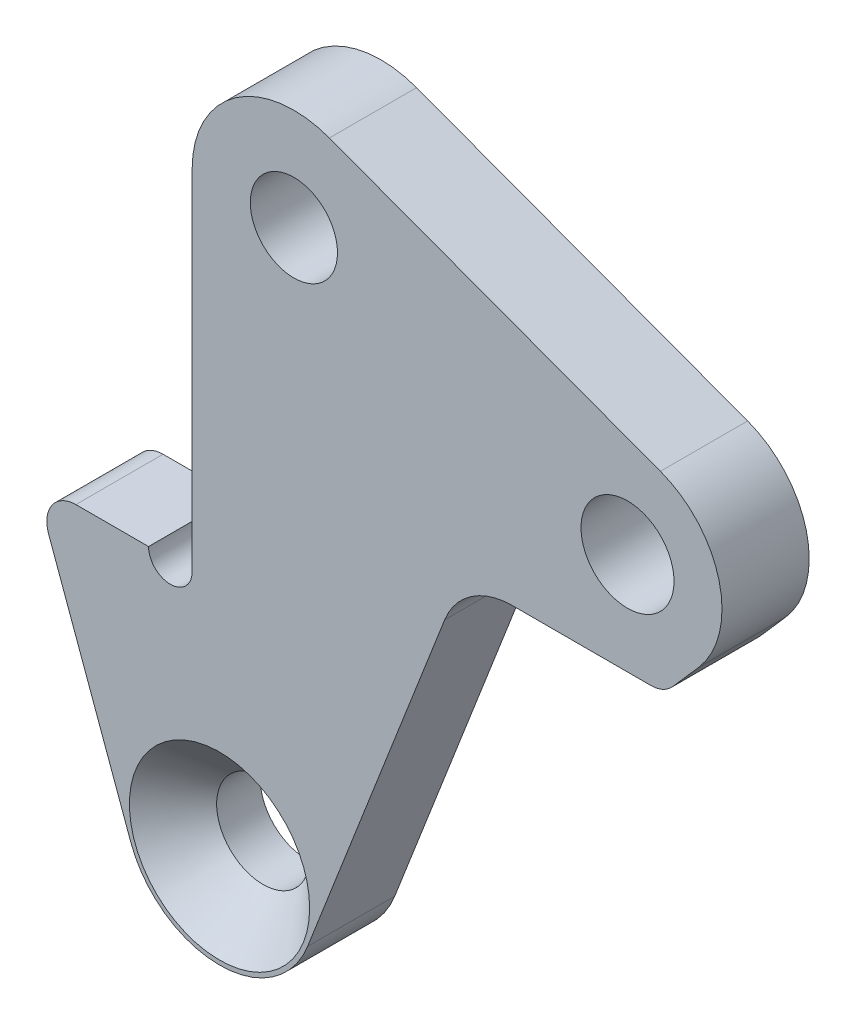
ISO-10303-21;
HEADER;
FILE_DESCRIPTION(('STEP AP214'),'2;1');
FILE_NAME('part.step','',(''),(''),'','','');
FILE_SCHEMA(('AUTOMOTIVE_DESIGN { 1 0 10303 214 1 1 1 1 }'));
ENDSEC;
DATA;
#1=APPLICATION_CONTEXT('core data for automotive mechanical design processes');
#2=APPLICATION_PROTOCOL_DEFINITION('international standard','automotive_design',2000,#1);
#3=PRODUCT_CONTEXT('',#1,'mechanical');
#4=PRODUCT('Part','Part','',(#3));
#5=PRODUCT_RELATED_PRODUCT_CATEGORY('part','',(#4));
#6=PRODUCT_DEFINITION_FORMATION('','',#4);
#7=PRODUCT_DEFINITION_CONTEXT('part definition',#1,'design');
#8=PRODUCT_DEFINITION('design','',#6,#7);
#9=PRODUCT_DEFINITION_SHAPE('','',#8);
#10=(LENGTH_UNIT() NAMED_UNIT(*) SI_UNIT(.MILLI.,.METRE.));
#11=(NAMED_UNIT(*) PLANE_ANGLE_UNIT() SI_UNIT($,.RADIAN.));
#12=(NAMED_UNIT(*) SI_UNIT($,.STERADIAN.) SOLID_ANGLE_UNIT());
#13=UNCERTAINTY_MEASURE_WITH_UNIT(LENGTH_MEASURE(1.E-05),#10,'distance_accuracy_value','');
#14=(GEOMETRIC_REPRESENTATION_CONTEXT(3) GLOBAL_UNCERTAINTY_ASSIGNED_CONTEXT((#13)) GLOBAL_UNIT_ASSIGNED_CONTEXT((#10,
#11,#12)) REPRESENTATION_CONTEXT('',''));
#15=CARTESIAN_POINT('',(0.,0.,0.));
#16=DIRECTION('',(0.,0.,1.));
#17=DIRECTION('',(1.,0.,0.));
#18=AXIS2_PLACEMENT_3D('',#15,#16,#17);
#19=CARTESIAN_POINT('',(0.,0.,1.5));
#20=DIRECTION('',(0.,0.,-1.));
#21=DIRECTION('',(-1.,0.,0.));
#22=AXIS2_PLACEMENT_3D('',#19,#20,#21);
#23=PLANE('',#22);
#24=CARTESIAN_POINT('',(-2.55780837206581,-20.,1.5));
#25=DIRECTION('',(0.,0.,-1.));
#26=DIRECTION('',(-1.,0.,0.));
#27=AXIS2_PLACEMENT_3D('',#24,#25,#26);
#28=CIRCLE('',#27,3.10000000000002);
#29=CARTESIAN_POINT('',(0.542191627934207,-20.,1.5));
#30=VERTEX_POINT('',#29);
#31=EDGE_CURVE('E248',#30,#30,#28,.T.);
#32=ORIENTED_EDGE('',*,*,#31,.T.);
#33=EDGE_LOOP('',(#32));
#34=FACE_BOUND('',#33,.T.);
#35=CARTESIAN_POINT('',(0.,0.,1.5));
#36=DIRECTION('',(0.,0.,1.));
#37=DIRECTION('',(1.,0.,0.));
#38=AXIS2_PLACEMENT_3D('',#35,#36,#37);
#39=CIRCLE('',#38,1.5);
#40=CARTESIAN_POINT('',(1.5,0.,1.5));
#41=VERTEX_POINT('',#40);
#42=EDGE_CURVE('E185',#41,#41,#39,.T.);
#43=ORIENTED_EDGE('',*,*,#42,.F.);
#44=EDGE_LOOP('',(#43));
#45=FACE_BOUND('',#44,.T.);
#46=CARTESIAN_POINT('',(11.4771790394003,-4.,1.5));
#47=DIRECTION('',(0.,0.,1.));
#48=DIRECTION('',(1.,0.,0.));
#49=AXIS2_PLACEMENT_3D('',#46,#47,#48);
#50=CIRCLE('',#49,1.6);
#51=CARTESIAN_POINT('',(13.0771790394003,-4.,1.5));
#52=VERTEX_POINT('',#51);
#53=EDGE_CURVE('E176',#52,#52,#50,.T.);
#54=ORIENTED_EDGE('',*,*,#53,.F.);
#55=EDGE_LOOP('',(#54));
#56=FACE_BOUND('',#55,.T.);
#57=DIRECTION('',(-1.,0.,0.));
#58=VECTOR('',#57,1.);
#59=CARTESIAN_POINT('',(5.80742685174699,-7.5,1.5));
#60=LINE('',#59,#58);
#61=CARTESIAN_POINT('',(12.2771829682659,-7.5,1.5));
#62=VERTEX_POINT('',#61);
#63=CARTESIAN_POINT('',(7.51561342335569,-7.5,1.5));
#64=VERTEX_POINT('',#63);
#65=EDGE_CURVE('E148',#62,#64,#60,.T.);
#66=ORIENTED_EDGE('',*,*,#65,.F.);
#67=CARTESIAN_POINT('',(12.2771829682659,-6.5,1.5));
#68=DIRECTION('',(0.,0.,-1.));
#69=DIRECTION('',(-1.,0.,0.));
#70=AXIS2_PLACEMENT_3D('',#67,#68,#69);
#71=CIRCLE('',#70,1.);
#72=CARTESIAN_POINT('',(13.0289444175339,-7.15943515480637,1.5));
#73=VERTEX_POINT('',#72);
#74=EDGE_CURVE('E59',#62,#73,#71,.F.);
#75=ORIENTED_EDGE('',*,*,#74,.T.);
#76=DIRECTION('',(0.659435154806362,0.75176144926799,0.));
#77=VECTOR('',#76,1.);
#78=CARTESIAN_POINT('',(-0.114583661944843,-22.1431642531207,1.5));
#79=LINE('',#78,#77);
#80=CARTESIAN_POINT('',(13.9204037495213,-6.14316425312068,1.5));
#81=VERTEX_POINT('',#80);
#82=EDGE_CURVE('E203',#73,#81,#79,.T.);
#83=ORIENTED_EDGE('',*,*,#82,.T.);
#84=CARTESIAN_POINT('',(11.4771790394003,-4.,1.5));
#85=DIRECTION('',(0.,0.,1.));
#86=DIRECTION('',(1.,0.,0.));
#87=AXIS2_PLACEMENT_3D('',#84,#85,#86);
#88=CIRCLE('',#87,3.25);
#89=CARTESIAN_POINT('',(12.6096632094642,-0.953694105222709,1.5));
#90=VERTEX_POINT('',#89);
#91=EDGE_CURVE('E205',#81,#90,#88,.T.);
#92=ORIENTED_EDGE('',*,*,#91,.T.);
#93=DIRECTION('',(-0.937324890700704,0.348456667711945,0.));
#94=VECTOR('',#93,1.);
#95=CARTESIAN_POINT('',(1.21959833699181,3.28063711745247,1.5));
#96=LINE('',#95,#94);
#97=CARTESIAN_POINT('',(1.21959833699181,3.28063711745247,1.5));
#98=VERTEX_POINT('',#97);
#99=EDGE_CURVE('E207',#90,#98,#96,.T.);
#100=ORIENTED_EDGE('',*,*,#99,.T.);
#101=CARTESIAN_POINT('',(0.,0.,1.5));
#102=DIRECTION('',(0.,0.,1.));
#103=DIRECTION('',(-1.,0.,0.));
#104=AXIS2_PLACEMENT_3D('',#101,#102,#103);
#105=CIRCLE('',#104,3.5);
#106=CARTESIAN_POINT('',(-3.5,0.,1.5));
#107=VERTEX_POINT('',#106);
#108=EDGE_CURVE('E209',#98,#107,#105,.T.);
#109=ORIENTED_EDGE('',*,*,#108,.T.);
#110=DIRECTION('',(0.,-1.,0.));
#111=VECTOR('',#110,1.);
#112=CARTESIAN_POINT('',(-3.5,-12.,1.5));
#113=LINE('',#112,#111);
#114=CARTESIAN_POINT('',(-3.5,-12.,1.5));
#115=VERTEX_POINT('',#114);
#116=EDGE_CURVE('E191',#107,#115,#113,.T.);
#117=ORIENTED_EDGE('',*,*,#116,.T.);
#118=CARTESIAN_POINT('',(-4.25,-12.,1.5));
#119=DIRECTION('',(0.,0.,1.));
#120=DIRECTION('',(1.,0.,0.));
#121=AXIS2_PLACEMENT_3D('',#118,#119,#120);
#122=CIRCLE('',#121,0.75);
#123=CARTESIAN_POINT('',(-5.,-12.,1.5));
#124=VERTEX_POINT('',#123);
#125=EDGE_CURVE('E165',#124,#115,#122,.T.);
#126=ORIENTED_EDGE('',*,*,#125,.F.);
#127=DIRECTION('',(-1.,0.,0.));
#128=VECTOR('',#127,1.);
#129=CARTESIAN_POINT('',(-7.5,-12.,1.5));
#130=LINE('',#129,#128);
#131=CARTESIAN_POINT('',(-7.5,-12.,1.5));
#132=VERTEX_POINT('',#131);
#133=EDGE_CURVE('E194',#124,#132,#130,.T.);
#134=ORIENTED_EDGE('',*,*,#133,.T.);
#135=CARTESIAN_POINT('',(-7.5,-13.,1.5));
#136=DIRECTION('',(0.,0.,1.));
#137=DIRECTION('',(1.,0.,0.));
#138=AXIS2_PLACEMENT_3D('',#135,#136,#137);
#139=CIRCLE('',#138,0.999999999999999);
#140=CARTESIAN_POINT('',(-8.43969262078591,-13.3420201433257,1.5));
#141=VERTEX_POINT('',#140);
#142=EDGE_CURVE('E197',#132,#141,#139,.T.);
#143=ORIENTED_EDGE('',*,*,#142,.T.);
#144=DIRECTION('',(0.342020143325666,-0.939692620785909,0.));
#145=VECTOR('',#144,1.);
#146=CARTESIAN_POINT('',(-8.43969262078591,-13.3420201433257,1.5));
#147=LINE('',#146,#145);
#148=CARTESIAN_POINT('',(-5.61180938962001,-21.1115654658084,1.5));
#149=VERTEX_POINT('',#148);
#150=EDGE_CURVE('E199',#141,#149,#147,.T.);
#151=ORIENTED_EDGE('',*,*,#150,.T.);
#152=CARTESIAN_POINT('',(-2.55780837206581,-20.,1.5));
#153=DIRECTION('',(0.,0.,1.));
#154=DIRECTION('',(1.,0.,0.));
#155=AXIS2_PLACEMENT_3D('',#152,#153,#154);
#156=CIRCLE('',#155,3.25);
#157=CARTESIAN_POINT('',(0.469932731190725,-21.1812213220438,1.5));
#158=VERTEX_POINT('',#157);
#159=EDGE_CURVE('E201',#149,#158,#156,.T.);
#160=ORIENTED_EDGE('',*,*,#159,.T.);
#161=DIRECTION('',(-0.363452714475013,-0.931612647155858,0.));
#162=VECTOR('',#161,1.);
#163=CARTESIAN_POINT('',(0.469932731190727,-21.1812213220438,1.5));
#164=LINE('',#163,#162);
#165=CARTESIAN_POINT('',(5.18658180546604,-9.09136821381247,1.5));
#166=VERTEX_POINT('',#165);
#167=EDGE_CURVE('E163',#166,#158,#164,.T.);
#168=ORIENTED_EDGE('',*,*,#167,.F.);
#169=CARTESIAN_POINT('',(7.51561342335569,-10.,1.5));
#170=DIRECTION('',(0.,0.,-1.));
#171=DIRECTION('',(-1.,0.,0.));
#172=AXIS2_PLACEMENT_3D('',#169,#170,#171);
#173=CIRCLE('',#172,2.5);
#174=EDGE_CURVE('E259',#166,#64,#173,.T.);
#175=ORIENTED_EDGE('',*,*,#174,.T.);
#176=EDGE_LOOP('',(#66,#75,#83,#92,#100,#109,#117,#126,#134,#143,#151,#160,#168,#175));
#177=FACE_BOUND('',#176,.T.);
#178=ADVANCED_FACE('F37',(#34,#45,#56,#177),#23,.F.);
#179=CARTESIAN_POINT('',(0.,0.,-1.5));
#180=DIRECTION('',(0.,0.,-1.));
#181=DIRECTION('',(-1.,0.,0.));
#182=AXIS2_PLACEMENT_3D('',#179,#180,#181);
#183=PLANE('',#182);
#184=CARTESIAN_POINT('',(11.4771790394003,-4.,-1.5));
#185=DIRECTION('',(0.,0.,1.));
#186=DIRECTION('',(1.,0.,0.));
#187=AXIS2_PLACEMENT_3D('',#184,#185,#186);
#188=CIRCLE('',#187,1.6);
#189=CARTESIAN_POINT('',(13.0771790394003,-4.,-1.5));
#190=VERTEX_POINT('',#189);
#191=EDGE_CURVE('E174',#190,#190,#188,.T.);
#192=ORIENTED_EDGE('',*,*,#191,.T.);
#193=EDGE_LOOP('',(#192));
#194=FACE_BOUND('',#193,.T.);
#195=CARTESIAN_POINT('',(0.,0.,-1.5));
#196=DIRECTION('',(0.,0.,1.));
#197=DIRECTION('',(1.,0.,0.));
#198=AXIS2_PLACEMENT_3D('',#195,#196,#197);
#199=CIRCLE('',#198,1.5);
#200=CARTESIAN_POINT('',(1.5,0.,-1.5));
#201=VERTEX_POINT('',#200);
#202=EDGE_CURVE('E184',#201,#201,#199,.T.);
#203=ORIENTED_EDGE('',*,*,#202,.T.);
#204=EDGE_LOOP('',(#203));
#205=FACE_BOUND('',#204,.T.);
#206=CARTESIAN_POINT('',(-2.55780837206581,-20.,-1.5));
#207=DIRECTION('',(0.,0.,1.));
#208=DIRECTION('',(1.,0.,0.));
#209=AXIS2_PLACEMENT_3D('',#206,#207,#208);
#210=CIRCLE('',#209,1.60000000000001);
#211=CARTESIAN_POINT('',(-0.957808372065798,-20.,-1.5));
#212=VERTEX_POINT('',#211);
#213=EDGE_CURVE('E179',#212,#212,#210,.T.);
#214=ORIENTED_EDGE('',*,*,#213,.T.);
#215=EDGE_LOOP('',(#214));
#216=FACE_BOUND('',#215,.T.);
#217=DIRECTION('',(0.659435154806362,0.75176144926799,0.));
#218=VECTOR('',#217,1.);
#219=CARTESIAN_POINT('',(-0.114583661944843,-22.1431642531207,-1.5));
#220=LINE('',#219,#218);
#221=CARTESIAN_POINT('',(13.0289444175339,-7.15943515480637,-1.5));
#222=VERTEX_POINT('',#221);
#223=CARTESIAN_POINT('',(13.9204037495213,-6.14316425312068,-1.5));
#224=VERTEX_POINT('',#223);
#225=EDGE_CURVE('E158',#222,#224,#220,.T.);
#226=ORIENTED_EDGE('',*,*,#225,.F.);
#227=CARTESIAN_POINT('',(12.2771829682659,-6.5,-1.5));
#228=DIRECTION('',(0.,0.,-1.));
#229=DIRECTION('',(-1.,0.,0.));
#230=AXIS2_PLACEMENT_3D('',#227,#228,#229);
#231=CIRCLE('',#230,1.);
#232=CARTESIAN_POINT('',(12.2771829682659,-7.5,-1.5));
#233=VERTEX_POINT('',#232);
#234=EDGE_CURVE('E11',#222,#233,#231,.T.);
#235=ORIENTED_EDGE('',*,*,#234,.T.);
#236=DIRECTION('',(-1.,0.,0.));
#237=VECTOR('',#236,1.);
#238=CARTESIAN_POINT('',(5.80742685174699,-7.5,-1.5));
#239=LINE('',#238,#237);
#240=CARTESIAN_POINT('',(7.51561342335569,-7.5,-1.5));
#241=VERTEX_POINT('',#240);
#242=EDGE_CURVE('E147',#233,#241,#239,.T.);
#243=ORIENTED_EDGE('',*,*,#242,.T.);
#244=CARTESIAN_POINT('',(7.51561342335569,-10.,-1.5));
#245=DIRECTION('',(0.,0.,-1.));
#246=DIRECTION('',(-1.,0.,0.));
#247=AXIS2_PLACEMENT_3D('',#244,#245,#246);
#248=CIRCLE('',#247,2.5);
#249=CARTESIAN_POINT('',(5.18658180546604,-9.09136821381247,-1.5));
#250=VERTEX_POINT('',#249);
#251=EDGE_CURVE('E142',#241,#250,#248,.F.);
#252=ORIENTED_EDGE('',*,*,#251,.T.);
#253=DIRECTION('',(-0.363452714475013,-0.931612647155858,0.));
#254=VECTOR('',#253,1.);
#255=CARTESIAN_POINT('',(0.469932731190727,-21.1812213220438,-1.5));
#256=LINE('',#255,#254);
#257=CARTESIAN_POINT('',(0.469932731190725,-21.1812213220438,-1.5));
#258=VERTEX_POINT('',#257);
#259=EDGE_CURVE('E136',#250,#258,#256,.T.);
#260=ORIENTED_EDGE('',*,*,#259,.T.);
#261=CARTESIAN_POINT('',(-2.55780837206581,-20.,-1.5));
#262=DIRECTION('',(0.,0.,1.));
#263=DIRECTION('',(1.,0.,0.));
#264=AXIS2_PLACEMENT_3D('',#261,#262,#263);
#265=CIRCLE('',#264,3.25);
#266=CARTESIAN_POINT('',(-5.61180938962001,-21.1115654658084,-1.5));
#267=VERTEX_POINT('',#266);
#268=EDGE_CURVE('E140',#267,#258,#265,.T.);
#269=ORIENTED_EDGE('',*,*,#268,.F.);
#270=DIRECTION('',(0.342020143325666,-0.939692620785909,0.));
#271=VECTOR('',#270,1.);
#272=CARTESIAN_POINT('',(-8.43969262078591,-13.3420201433257,-1.5));
#273=LINE('',#272,#271);
#274=CARTESIAN_POINT('',(-8.43969262078591,-13.3420201433257,-1.5));
#275=VERTEX_POINT('',#274);
#276=EDGE_CURVE('E159',#275,#267,#273,.T.);
#277=ORIENTED_EDGE('',*,*,#276,.F.);
#278=CARTESIAN_POINT('',(-7.5,-13.,-1.5));
#279=DIRECTION('',(0.,0.,1.));
#280=DIRECTION('',(1.,0.,0.));
#281=AXIS2_PLACEMENT_3D('',#278,#279,#280);
#282=CIRCLE('',#281,0.999999999999999);
#283=CARTESIAN_POINT('',(-7.5,-12.,-1.5));
#284=VERTEX_POINT('',#283);
#285=EDGE_CURVE('E216',#284,#275,#282,.T.);
#286=ORIENTED_EDGE('',*,*,#285,.F.);
#287=DIRECTION('',(-1.,0.,0.));
#288=VECTOR('',#287,1.);
#289=CARTESIAN_POINT('',(-7.5,-12.,-1.5));
#290=LINE('',#289,#288);
#291=CARTESIAN_POINT('',(-5.,-12.,-1.5));
#292=VERTEX_POINT('',#291);
#293=EDGE_CURVE('E214',#292,#284,#290,.T.);
#294=ORIENTED_EDGE('',*,*,#293,.F.);
#295=CARTESIAN_POINT('',(-4.25,-12.,-1.5));
#296=DIRECTION('',(0.,0.,1.));
#297=DIRECTION('',(1.,0.,0.));
#298=AXIS2_PLACEMENT_3D('',#295,#296,#297);
#299=CIRCLE('',#298,0.75);
#300=CARTESIAN_POINT('',(-3.5,-12.,-1.5));
#301=VERTEX_POINT('',#300);
#302=EDGE_CURVE('E167',#292,#301,#299,.T.);
#303=ORIENTED_EDGE('',*,*,#302,.T.);
#304=DIRECTION('',(0.,-1.,0.));
#305=VECTOR('',#304,1.);
#306=CARTESIAN_POINT('',(-3.5,-12.,-1.5));
#307=LINE('',#306,#305);
#308=CARTESIAN_POINT('',(-3.5,0.,-1.5));
#309=VERTEX_POINT('',#308);
#310=EDGE_CURVE('E188',#309,#301,#307,.T.);
#311=ORIENTED_EDGE('',*,*,#310,.F.);
#312=CARTESIAN_POINT('',(0.,0.,-1.5));
#313=DIRECTION('',(0.,0.,1.));
#314=DIRECTION('',(-1.,0.,0.));
#315=AXIS2_PLACEMENT_3D('',#312,#313,#314);
#316=CIRCLE('',#315,3.5);
#317=CARTESIAN_POINT('',(1.21959833699181,3.28063711745247,-1.5));
#318=VERTEX_POINT('',#317);
#319=EDGE_CURVE('E195',#318,#309,#316,.T.);
#320=ORIENTED_EDGE('',*,*,#319,.F.);
#321=DIRECTION('',(-0.937324890700704,0.348456667711945,0.));
#322=VECTOR('',#321,1.);
#323=CARTESIAN_POINT('',(1.21959833699181,3.28063711745247,-1.5));
#324=LINE('',#323,#322);
#325=CARTESIAN_POINT('',(12.6096632094642,-0.953694105222709,-1.5));
#326=VERTEX_POINT('',#325);
#327=EDGE_CURVE('E222',#326,#318,#324,.T.);
#328=ORIENTED_EDGE('',*,*,#327,.F.);
#329=CARTESIAN_POINT('',(11.4771790394003,-4.,-1.5));
#330=DIRECTION('',(0.,0.,1.));
#331=DIRECTION('',(1.,0.,0.));
#332=AXIS2_PLACEMENT_3D('',#329,#330,#331);
#333=CIRCLE('',#332,3.25);
#334=EDGE_CURVE('E220',#224,#326,#333,.T.);
#335=ORIENTED_EDGE('',*,*,#334,.F.);
#336=EDGE_LOOP('',(#226,#235,#243,#252,#260,#269,#277,#286,#294,#303,#311,#320,#328,#335));
#337=FACE_BOUND('',#336,.T.);
#338=ADVANCED_FACE('F138',(#194,#205,#216,#337),#183,.T.);
#339=CARTESIAN_POINT('',(-3.5,-12.,1.5));
#340=DIRECTION('',(1.,0.,0.));
#341=DIRECTION('',(0.,0.,-1.));
#342=AXIS2_PLACEMENT_3D('',#339,#340,#341);
#343=PLANE('',#342);
#344=ORIENTED_EDGE('',*,*,#310,.T.);
#345=DIRECTION('',(0.,0.,-1.));
#346=VECTOR('',#345,1.);
#347=CARTESIAN_POINT('',(-3.5,-12.,1.5));
#348=LINE('',#347,#346);
#349=EDGE_CURVE('E243',#115,#301,#348,.T.);
#350=ORIENTED_EDGE('',*,*,#349,.F.);
#351=ORIENTED_EDGE('',*,*,#116,.F.);
#352=DIRECTION('',(0.,0.,-1.));
#353=VECTOR('',#352,1.);
#354=CARTESIAN_POINT('',(-3.5,0.,1.5));
#355=LINE('',#354,#353);
#356=EDGE_CURVE('E211',#107,#309,#355,.T.);
#357=ORIENTED_EDGE('',*,*,#356,.T.);
#358=EDGE_LOOP('',(#344,#350,#351,#357));
#359=FACE_BOUND('',#358,.T.);
#360=ADVANCED_FACE('F288',(#359),#343,.F.);
#361=CARTESIAN_POINT('',(-7.5,-12.,1.5));
#362=DIRECTION('',(0.,-1.,0.));
#363=DIRECTION('',(0.,0.,-1.));
#364=AXIS2_PLACEMENT_3D('',#361,#362,#363);
#365=PLANE('',#364);
#366=ORIENTED_EDGE('',*,*,#133,.F.);
#367=DIRECTION('',(0.,0.,1.));
#368=VECTOR('',#367,1.);
#369=CARTESIAN_POINT('',(-5.,-12.,-1.5));
#370=LINE('',#369,#368);
#371=EDGE_CURVE('E251',#124,#292,#370,.F.);
#372=ORIENTED_EDGE('',*,*,#371,.T.);
#373=ORIENTED_EDGE('',*,*,#293,.T.);
#374=DIRECTION('',(0.,0.,-1.));
#375=VECTOR('',#374,1.);
#376=CARTESIAN_POINT('',(-7.5,-12.,1.5));
#377=LINE('',#376,#375);
#378=EDGE_CURVE('E240',#132,#284,#377,.T.);
#379=ORIENTED_EDGE('',*,*,#378,.F.);
#380=EDGE_LOOP('',(#366,#372,#373,#379));
#381=FACE_BOUND('',#380,.T.);
#382=ADVANCED_FACE('F320',(#381),#365,.F.);
#383=CARTESIAN_POINT('',(-7.5,-13.,1.5));
#384=DIRECTION('',(0.,0.,-1.));
#385=DIRECTION('',(-1.,0.,0.));
#386=AXIS2_PLACEMENT_3D('',#383,#384,#385);
#387=CYLINDRICAL_SURFACE('',#386,0.999999999999999);
#388=ORIENTED_EDGE('',*,*,#285,.T.);
#389=DIRECTION('',(0.,0.,-1.));
#390=VECTOR('',#389,1.);
#391=CARTESIAN_POINT('',(-8.43969262078591,-13.3420201433257,1.5));
#392=LINE('',#391,#390);
#393=EDGE_CURVE('E237',#141,#275,#392,.T.);
#394=ORIENTED_EDGE('',*,*,#393,.F.);
#395=ORIENTED_EDGE('',*,*,#142,.F.);
#396=ORIENTED_EDGE('',*,*,#378,.T.);
#397=EDGE_LOOP('',(#388,#394,#395,#396));
#398=FACE_BOUND('',#397,.T.);
#399=ADVANCED_FACE('F316',(#398),#387,.T.);
#400=CARTESIAN_POINT('',(-8.43969262078591,-13.3420201433257,1.5));
#401=DIRECTION('',(0.939692620785909,0.342020143325666,0.));
#402=DIRECTION('',(-0.342020143325666,0.93969262078591,0.));
#403=AXIS2_PLACEMENT_3D('',#400,#401,#402);
#404=PLANE('',#403);
#405=ORIENTED_EDGE('',*,*,#276,.T.);
#406=DIRECTION('',(0.,0.,-1.));
#407=VECTOR('',#406,1.);
#408=CARTESIAN_POINT('',(-5.61180938962001,-21.1115654658084,1.5));
#409=LINE('',#408,#407);
#410=EDGE_CURVE('E157',#149,#267,#409,.T.);
#411=ORIENTED_EDGE('',*,*,#410,.F.);
#412=ORIENTED_EDGE('',*,*,#150,.F.);
#413=ORIENTED_EDGE('',*,*,#393,.T.);
#414=EDGE_LOOP('',(#405,#411,#412,#413));
#415=FACE_BOUND('',#414,.T.);
#416=ADVANCED_FACE('F313',(#415),#404,.F.);
#417=CARTESIAN_POINT('',(-2.55780837206581,-20.,1.5));
#418=DIRECTION('',(0.,0.,-1.));
#419=DIRECTION('',(-1.,0.,0.));
#420=AXIS2_PLACEMENT_3D('',#417,#418,#419);
#421=CYLINDRICAL_SURFACE('',#420,3.25);
#422=ORIENTED_EDGE('',*,*,#268,.T.);
#423=DIRECTION('',(0.,0.,1.));
#424=VECTOR('',#423,1.);
#425=CARTESIAN_POINT('',(0.469932731190725,-21.1812213220438,-1.5));
#426=LINE('',#425,#424);
#427=EDGE_CURVE('E155',#258,#158,#426,.T.);
#428=ORIENTED_EDGE('',*,*,#427,.T.);
#429=ORIENTED_EDGE('',*,*,#159,.F.);
#430=ORIENTED_EDGE('',*,*,#410,.T.);
#431=EDGE_LOOP('',(#422,#428,#429,#430));
#432=FACE_BOUND('',#431,.T.);
#433=ADVANCED_FACE('F153',(#432),#421,.T.);
#434=CARTESIAN_POINT('',(-0.114583661944843,-22.1431642531207,1.5));
#435=DIRECTION('',(-0.75176144926799,0.659435154806362,0.));
#436=DIRECTION('',(-0.659435154806362,-0.75176144926799,0.));
#437=AXIS2_PLACEMENT_3D('',#434,#435,#436);
#438=PLANE('',#437);
#439=ORIENTED_EDGE('',*,*,#82,.F.);
#440=DIRECTION('',(0.,0.,1.));
#441=VECTOR('',#440,1.);
#442=CARTESIAN_POINT('',(13.0289444175339,-7.15943515480636,1.5));
#443=LINE('',#442,#441);
#444=EDGE_CURVE('E45',#73,#222,#443,.F.);
#445=ORIENTED_EDGE('',*,*,#444,.T.);
#446=ORIENTED_EDGE('',*,*,#225,.T.);
#447=DIRECTION('',(0.,0.,-1.));
#448=VECTOR('',#447,1.);
#449=CARTESIAN_POINT('',(13.9204037495213,-6.14316425312068,1.5));
#450=LINE('',#449,#448);
#451=EDGE_CURVE('E233',#81,#224,#450,.T.);
#452=ORIENTED_EDGE('',*,*,#451,.F.);
#453=EDGE_LOOP('',(#439,#445,#446,#452));
#454=FACE_BOUND('',#453,.T.);
#455=ADVANCED_FACE('F307',(#454),#438,.F.);
#456=CARTESIAN_POINT('',(11.4771790394003,-4.,1.5));
#457=DIRECTION('',(0.,0.,-1.));
#458=DIRECTION('',(-1.,0.,0.));
#459=AXIS2_PLACEMENT_3D('',#456,#457,#458);
#460=CYLINDRICAL_SURFACE('',#459,3.25);
#461=ORIENTED_EDGE('',*,*,#334,.T.);
#462=DIRECTION('',(0.,0.,-1.));
#463=VECTOR('',#462,1.);
#464=CARTESIAN_POINT('',(12.6096632094642,-0.953694105222709,1.5));
#465=LINE('',#464,#463);
#466=EDGE_CURVE('E230',#90,#326,#465,.T.);
#467=ORIENTED_EDGE('',*,*,#466,.F.);
#468=ORIENTED_EDGE('',*,*,#91,.F.);
#469=ORIENTED_EDGE('',*,*,#451,.T.);
#470=EDGE_LOOP('',(#461,#467,#468,#469));
#471=FACE_BOUND('',#470,.T.);
#472=ADVANCED_FACE('F303',(#471),#460,.T.);
#473=CARTESIAN_POINT('',(1.21959833699181,3.28063711745247,1.5));
#474=DIRECTION('',(-0.348456667711945,-0.937324890700704,0.));
#475=DIRECTION('',(0.937324890700705,-0.348456667711945,0.));
#476=AXIS2_PLACEMENT_3D('',#473,#474,#475);
#477=PLANE('',#476);
#478=ORIENTED_EDGE('',*,*,#327,.T.);
#479=DIRECTION('',(0.,0.,-1.));
#480=VECTOR('',#479,1.);
#481=CARTESIAN_POINT('',(1.21959833699181,3.28063711745247,1.5));
#482=LINE('',#481,#480);
#483=EDGE_CURVE('E227',#98,#318,#482,.T.);
#484=ORIENTED_EDGE('',*,*,#483,.F.);
#485=ORIENTED_EDGE('',*,*,#99,.F.);
#486=ORIENTED_EDGE('',*,*,#466,.T.);
#487=EDGE_LOOP('',(#478,#484,#485,#486));
#488=FACE_BOUND('',#487,.T.);
#489=ADVANCED_FACE('F299',(#488),#477,.F.);
#490=CARTESIAN_POINT('',(0.,0.,1.5));
#491=DIRECTION('',(0.,0.,-1.));
#492=DIRECTION('',(-1.,0.,0.));
#493=AXIS2_PLACEMENT_3D('',#490,#491,#492);
#494=CYLINDRICAL_SURFACE('',#493,3.5);
#495=ORIENTED_EDGE('',*,*,#319,.T.);
#496=ORIENTED_EDGE('',*,*,#356,.F.);
#497=ORIENTED_EDGE('',*,*,#108,.F.);
#498=ORIENTED_EDGE('',*,*,#483,.T.);
#499=EDGE_LOOP('',(#495,#496,#497,#498));
#500=FACE_BOUND('',#499,.T.);
#501=ADVANCED_FACE('F296',(#500),#494,.T.);
#502=CARTESIAN_POINT('',(0.,0.,1.5));
#503=DIRECTION('',(0.,0.,-1.));
#504=DIRECTION('',(-1.,0.,0.));
#505=AXIS2_PLACEMENT_3D('',#502,#503,#504);
#506=CYLINDRICAL_SURFACE('',#505,1.5);
#507=ORIENTED_EDGE('',*,*,#42,.T.);
#508=EDGE_LOOP('',(#507));
#509=FACE_BOUND('',#508,.T.);
#510=ORIENTED_EDGE('',*,*,#202,.F.);
#511=EDGE_LOOP('',(#510));
#512=FACE_BOUND('',#511,.T.);
#513=ADVANCED_FACE('F293',(#509,#512),#506,.F.);
#514=CARTESIAN_POINT('',(-2.55780837206581,-20.,1.5));
#515=DIRECTION('',(0.,0.,-1.));
#516=DIRECTION('',(-1.,0.,0.));
#517=AXIS2_PLACEMENT_3D('',#514,#515,#516);
#518=CYLINDRICAL_SURFACE('',#517,1.60000000000001);
#519=CARTESIAN_POINT('',(-2.55780837206581,-20.,0.));
#520=DIRECTION('',(0.,0.,-1.));
#521=DIRECTION('',(-1.,0.,0.));
#522=AXIS2_PLACEMENT_3D('',#519,#520,#521);
#523=CIRCLE('',#522,1.60000000000001);
#524=CARTESIAN_POINT('',(-0.957808372065798,-20.,0.));
#525=VERTEX_POINT('',#524);
#526=EDGE_CURVE('E245',#525,#525,#523,.F.);
#527=ORIENTED_EDGE('',*,*,#526,.T.);
#528=EDGE_LOOP('',(#527));
#529=FACE_BOUND('',#528,.T.);
#530=ORIENTED_EDGE('',*,*,#213,.F.);
#531=EDGE_LOOP('',(#530));
#532=FACE_BOUND('',#531,.T.);
#533=ADVANCED_FACE('F341',(#529,#532),#518,.F.);
#534=CARTESIAN_POINT('',(11.4771790394003,-4.,1.5));
#535=DIRECTION('',(0.,0.,-1.));
#536=DIRECTION('',(-1.,0.,0.));
#537=AXIS2_PLACEMENT_3D('',#534,#535,#536);
#538=CYLINDRICAL_SURFACE('',#537,1.6);
#539=ORIENTED_EDGE('',*,*,#53,.T.);
#540=EDGE_LOOP('',(#539));
#541=FACE_BOUND('',#540,.T.);
#542=ORIENTED_EDGE('',*,*,#191,.F.);
#543=EDGE_LOOP('',(#542));
#544=FACE_BOUND('',#543,.T.);
#545=ADVANCED_FACE('F333',(#541,#544),#538,.F.);
#546=CARTESIAN_POINT('',(-2.55780837206581,-20.,0.));
#547=DIRECTION('',(0.,0.,1.));
#548=DIRECTION('',(1.,0.,0.));
#549=AXIS2_PLACEMENT_3D('',#546,#547,#548);
#550=CONICAL_SURFACE('',#549,1.60000000000001,0.785398163397449);
#551=CARTESIAN_POINT('',(0.542191627934207,-20.,1.5));
#552=CARTESIAN_POINT('',(0.526566627934207,-20.,1.484375));
#553=CARTESIAN_POINT('',(0.510941627934207,-20.,1.46875));
#554=CARTESIAN_POINT('',(0.479691627934207,-20.,1.4375));
#555=CARTESIAN_POINT('',(0.464066627934207,-20.,1.421875));
#556=CARTESIAN_POINT('',(0.432816627934207,-20.,1.390625));
#557=CARTESIAN_POINT('',(0.417191627934207,-20.,1.375));
#558=CARTESIAN_POINT('',(0.385941627934207,-20.,1.34375));
#559=CARTESIAN_POINT('',(0.370316627934207,-20.,1.328125));
#560=CARTESIAN_POINT('',(0.339066627934207,-20.,1.296875));
#561=CARTESIAN_POINT('',(0.323441627934207,-20.,1.28125));
#562=CARTESIAN_POINT('',(0.292191627934206,-20.,1.25));
#563=CARTESIAN_POINT('',(0.276566627934206,-20.,1.234375));
#564=CARTESIAN_POINT('',(0.245316627934206,-20.,1.203125));
#565=CARTESIAN_POINT('',(0.229691627934206,-20.,1.1875));
#566=CARTESIAN_POINT('',(0.198441627934206,-20.,1.15625));
#567=CARTESIAN_POINT('',(0.182816627934206,-20.,1.140625));
#568=CARTESIAN_POINT('',(0.151566627934206,-20.,1.109375));
#569=CARTESIAN_POINT('',(0.135941627934206,-20.,1.09375));
#570=CARTESIAN_POINT('',(0.104691627934206,-20.,1.0625));
#571=CARTESIAN_POINT('',(0.089066627934206,-20.,1.046875));
#572=CARTESIAN_POINT('',(0.0578166279342058,-20.,1.015625));
#573=CARTESIAN_POINT('',(0.0421916279342057,-20.,0.999999999999999));
#574=CARTESIAN_POINT('',(0.0109416279342055,-20.,0.968749999999999));
#575=CARTESIAN_POINT('',(-0.00468337206579455,-20.,0.953124999999999));
#576=CARTESIAN_POINT('',(-0.0359333720657946,-20.,0.921874999999999));
#577=CARTESIAN_POINT('',(-0.0515583720657945,-20.,0.906249999999999));
#578=CARTESIAN_POINT('',(-0.0828083720657947,-20.,0.874999999999999));
#579=CARTESIAN_POINT('',(-0.0984333720657949,-20.,0.859374999999999));
#580=CARTESIAN_POINT('',(-0.129683372065795,-20.,0.828124999999999));
#581=CARTESIAN_POINT('',(-0.145308372065795,-20.,0.812499999999999));
#582=CARTESIAN_POINT('',(-0.176558372065795,-20.,0.781249999999999));
#583=CARTESIAN_POINT('',(-0.192183372065795,-20.,0.765624999999999));
#584=CARTESIAN_POINT('',(-0.223433372065795,-20.,0.734374999999998));
#585=CARTESIAN_POINT('',(-0.239058372065795,-20.,0.718749999999998));
#586=CARTESIAN_POINT('',(-0.270308372065795,-20.,0.687499999999998));
#587=CARTESIAN_POINT('',(-0.285933372065796,-20.,0.671874999999998));
#588=CARTESIAN_POINT('',(-0.317183372065796,-20.,0.640624999999998));
#589=CARTESIAN_POINT('',(-0.332808372065796,-20.,0.624999999999998));
#590=CARTESIAN_POINT('',(-0.364058372065796,-20.,0.593749999999998));
#591=CARTESIAN_POINT('',(-0.379683372065796,-20.,0.578124999999998));
#592=CARTESIAN_POINT('',(-0.410933372065796,-20.,0.546874999999998));
#593=CARTESIAN_POINT('',(-0.426558372065796,-20.,0.531249999999998));
#594=CARTESIAN_POINT('',(-0.457808372065796,-20.,0.499999999999998));
#595=CARTESIAN_POINT('',(-0.473433372065796,-20.,0.484374999999998));
#596=CARTESIAN_POINT('',(-0.504683372065796,-20.,0.453124999999998));
#597=CARTESIAN_POINT('',(-0.520308372065796,-20.,0.437499999999998));
#598=CARTESIAN_POINT('',(-0.551558372065796,-20.,0.406249999999998));
#599=CARTESIAN_POINT('',(-0.567183372065797,-20.,0.390624999999998));
#600=CARTESIAN_POINT('',(-0.598433372065797,-20.,0.359374999999998));
#601=CARTESIAN_POINT('',(-0.614058372065797,-20.,0.343749999999998));
#602=CARTESIAN_POINT('',(-0.645308372065797,-20.,0.312499999999998));
#603=CARTESIAN_POINT('',(-0.660933372065797,-20.,0.296874999999998));
#604=CARTESIAN_POINT('',(-0.692183372065797,-20.,0.265624999999998));
#605=CARTESIAN_POINT('',(-0.707808372065797,-20.,0.249999999999998));
#606=CARTESIAN_POINT('',(-0.739058372065797,-20.,0.218749999999997));
#607=CARTESIAN_POINT('',(-0.754683372065797,-20.,0.203124999999997));
#608=CARTESIAN_POINT('',(-0.785933372065797,-20.,0.171874999999997));
#609=CARTESIAN_POINT('',(-0.801558372065797,-20.,0.156249999999997));
#610=CARTESIAN_POINT('',(-0.832808372065797,-20.,0.124999999999997));
#611=CARTESIAN_POINT('',(-0.848433372065797,-20.,0.109374999999997));
#612=CARTESIAN_POINT('',(-0.879683372065798,-20.,0.0781249999999971));
#613=CARTESIAN_POINT('',(-0.895308372065798,-20.,0.0624999999999971));
#614=CARTESIAN_POINT('',(-0.926558372065798,-20.,0.031249999999997));
#615=CARTESIAN_POINT('',(-0.942183372065798,-20.,0.015624999999997));
#616=CARTESIAN_POINT('',(-0.957808372065798,-20.,0.));
#617=B_SPLINE_CURVE_WITH_KNOTS('',3,(#551,#552,#553,#554,#555,#556,#557,#558,#559,#560,#561,
#562,#563,#564,#565,#566,#567,#568,#569,#570,#571,#572,#573,#574,#575,#576,#577,#578,#579,#580,
#581,#582,#583,#584,#585,#586,#587,#588,#589,#590,#591,#592,#593,#594,#595,#596,#597,#598,#599,
#600,#601,#602,#603,#604,#605,#606,#607,#608,#609,#610,#611,#612,#613,#614,#615,#616),
.UNSPECIFIED.,.F.,.F.,(4,2,2,2,2,2,2,2,2,2,2,2,2,2,2,2,2,2,2,2,2,2,2,2,2,2,2,2,2,2,2,2,4),(0.,
0.0662912607362389,0.132582521472478,0.198873782208717,0.265165042944956,0.331456303681195,
0.397747564417434,0.464038825153673,0.530330085889912,0.596621346626151,0.66291260736239,
0.729203868098629,0.795495128834868,0.861786389571107,0.928077650307346,0.994368911043585,
1.06066017177982,1.12695143251606,1.1932426932523,1.25953395398854,1.32582521472478,
1.39211647546102,1.45840773619726,1.5246989969335,1.59099025766974,1.65728151840598,
1.72357277914221,1.78986403987845,1.85615530061469,1.92244656135093,1.98873782208717,
2.05502908282341,2.12132034355965),.UNSPECIFIED.);
#618=EDGE_CURVE('BSEAM328',#30,#525,#617,.T.);
#619=ORIENTED_EDGE('',*,*,#31,.F.);
#620=ORIENTED_EDGE('',*,*,#526,.F.);
#621=ORIENTED_EDGE('',*,*,#618,.T.);
#622=ORIENTED_EDGE('',*,*,#618,.F.);
#623=EDGE_LOOP('',(#619,#621,#620,#622));
#624=FACE_BOUND('',#623,.T.);
#625=ADVANCED_FACE('F328',(#624),#550,.F.);
#626=CARTESIAN_POINT('',(-4.25,-12.,-1.5));
#627=DIRECTION('',(0.,0.,1.));
#628=DIRECTION('',(1.,0.,0.));
#629=AXIS2_PLACEMENT_3D('',#626,#627,#628);
#630=CYLINDRICAL_SURFACE('',#629,0.75);
#631=ORIENTED_EDGE('',*,*,#302,.F.);
#632=ORIENTED_EDGE('',*,*,#371,.F.);
#633=ORIENTED_EDGE('',*,*,#125,.T.);
#634=ORIENTED_EDGE('',*,*,#349,.T.);
#635=EDGE_LOOP('',(#631,#632,#633,#634));
#636=FACE_BOUND('',#635,.T.);
#637=ADVANCED_FACE('F332',(#636),#630,.F.);
#638=CARTESIAN_POINT('',(0.469932731190727,-21.1812213220438,-1.5));
#639=DIRECTION('',(-0.931612647155858,0.363452714475013,0.));
#640=DIRECTION('',(-0.363452714475013,-0.931612647155858,0.));
#641=AXIS2_PLACEMENT_3D('',#638,#639,#640);
#642=PLANE('',#641);
#643=ORIENTED_EDGE('',*,*,#259,.F.);
#644=DIRECTION('',(0.,0.,1.));
#645=VECTOR('',#644,1.);
#646=CARTESIAN_POINT('',(5.18658180546604,-9.09136821381247,1.5));
#647=LINE('',#646,#645);
#648=EDGE_CURVE('E254',#250,#166,#647,.T.);
#649=ORIENTED_EDGE('',*,*,#648,.T.);
#650=ORIENTED_EDGE('',*,*,#167,.T.);
#651=ORIENTED_EDGE('',*,*,#427,.F.);
#652=EDGE_LOOP('',(#643,#649,#650,#651));
#653=FACE_BOUND('',#652,.T.);
#654=ADVANCED_FACE('F161',(#653),#642,.F.);
#655=CARTESIAN_POINT('',(5.80742685174699,-7.5,-1.5));
#656=DIRECTION('',(0.,1.,0.));
#657=DIRECTION('',(-1.,0.,0.));
#658=AXIS2_PLACEMENT_3D('',#655,#656,#657);
#659=PLANE('',#658);
#660=ORIENTED_EDGE('',*,*,#242,.F.);
#661=DIRECTION('',(0.,0.,1.));
#662=VECTOR('',#661,1.);
#663=CARTESIAN_POINT('',(12.2771829682659,-7.5,-1.5));
#664=LINE('',#663,#662);
#665=EDGE_CURVE('E263',#233,#62,#664,.T.);
#666=ORIENTED_EDGE('',*,*,#665,.T.);
#667=ORIENTED_EDGE('',*,*,#65,.T.);
#668=DIRECTION('',(0.,0.,1.));
#669=VECTOR('',#668,1.);
#670=CARTESIAN_POINT('',(7.51561342335569,-7.5,-1.5));
#671=LINE('',#670,#669);
#672=EDGE_CURVE('E256',#64,#241,#671,.F.);
#673=ORIENTED_EDGE('',*,*,#672,.T.);
#674=EDGE_LOOP('',(#660,#666,#667,#673));
#675=FACE_BOUND('',#674,.T.);
#676=ADVANCED_FACE('F269',(#675),#659,.F.);
#677=CARTESIAN_POINT('',(7.51561342335569,-10.,-1.5));
#678=DIRECTION('',(0.,0.,-1.));
#679=DIRECTION('',(-1.,0.,0.));
#680=AXIS2_PLACEMENT_3D('',#677,#678,#679);
#681=CYLINDRICAL_SURFACE('',#680,2.5);
#682=ORIENTED_EDGE('',*,*,#251,.F.);
#683=ORIENTED_EDGE('',*,*,#672,.F.);
#684=ORIENTED_EDGE('',*,*,#174,.F.);
#685=ORIENTED_EDGE('',*,*,#648,.F.);
#686=EDGE_LOOP('',(#682,#683,#684,#685));
#687=FACE_BOUND('',#686,.T.);
#688=ADVANCED_FACE('F274',(#687),#681,.F.);
#689=CARTESIAN_POINT('',(12.2771829682659,-6.5,-1.5));
#690=DIRECTION('',(0.,0.,1.));
#691=DIRECTION('',(1.,0.,0.));
#692=AXIS2_PLACEMENT_3D('',#689,#690,#691);
#693=CYLINDRICAL_SURFACE('',#692,1.);
#694=ORIENTED_EDGE('',*,*,#234,.F.);
#695=ORIENTED_EDGE('',*,*,#444,.F.);
#696=ORIENTED_EDGE('',*,*,#74,.F.);
#697=ORIENTED_EDGE('',*,*,#665,.F.);
#698=EDGE_LOOP('',(#694,#695,#696,#697));
#699=FACE_BOUND('',#698,.T.);
#700=ADVANCED_FACE('F39',(#699),#693,.T.);
#701=CLOSED_SHELL('',(#178,#338,#360,#382,#399,#416,#433,#455,#472,#489,#501,#513,#533,#545,
#625,#637,#654,#676,#688,#700));
#702=MANIFOLD_SOLID_BREP('B2',#701);
#703=ADVANCED_BREP_SHAPE_REPRESENTATION('',(#18,#702),#14);
#704=SHAPE_DEFINITION_REPRESENTATION(#9,#703);
ENDSEC;
END-ISO-10303-21;
